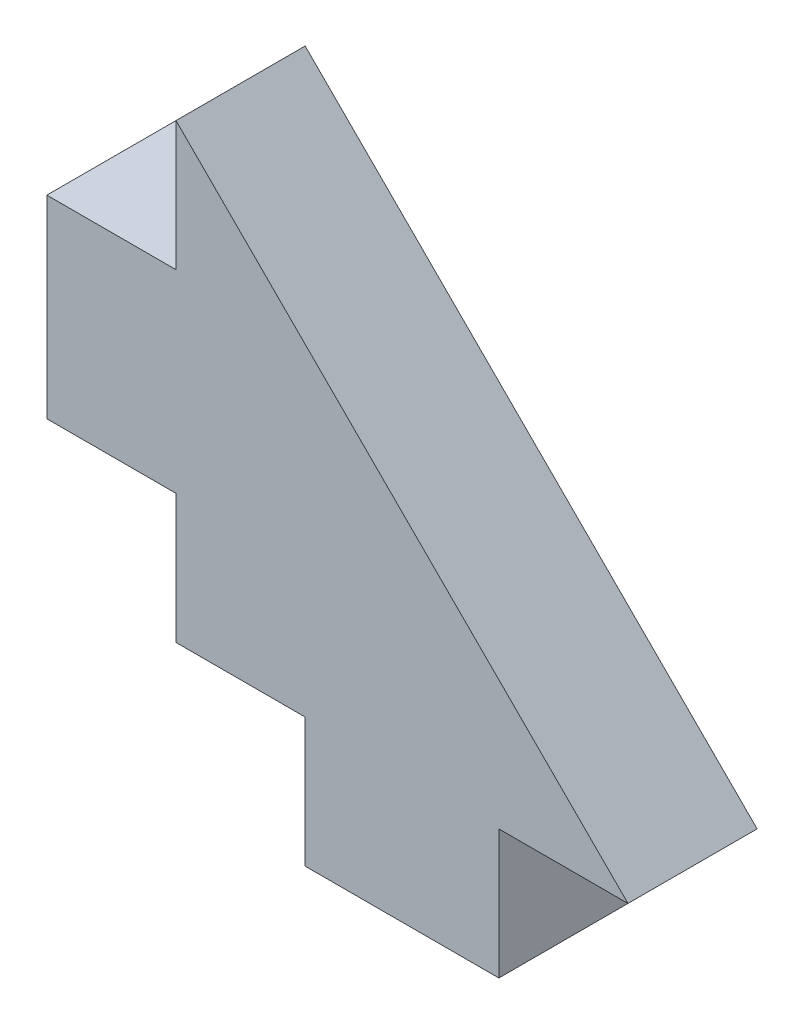
ISO-10303-21;
HEADER;
FILE_DESCRIPTION(('STEP AP214'),'2;1');
FILE_NAME('part.step','',(''),(''),'','','');
FILE_SCHEMA(('AUTOMOTIVE_DESIGN { 1 0 10303 214 1 1 1 1 }'));
ENDSEC;
DATA;
#1=APPLICATION_CONTEXT('core data for automotive mechanical design processes');
#2=APPLICATION_PROTOCOL_DEFINITION('international standard','automotive_design',2000,#1);
#3=PRODUCT_CONTEXT('',#1,'mechanical');
#4=PRODUCT('Part','Part','',(#3));
#5=PRODUCT_RELATED_PRODUCT_CATEGORY('part','',(#4));
#6=PRODUCT_DEFINITION_FORMATION('','',#4);
#7=PRODUCT_DEFINITION_CONTEXT('part definition',#1,'design');
#8=PRODUCT_DEFINITION('design','',#6,#7);
#9=PRODUCT_DEFINITION_SHAPE('','',#8);
#10=(LENGTH_UNIT() NAMED_UNIT(*) SI_UNIT(.MILLI.,.METRE.));
#11=(NAMED_UNIT(*) PLANE_ANGLE_UNIT() SI_UNIT($,.RADIAN.));
#12=(NAMED_UNIT(*) SI_UNIT($,.STERADIAN.) SOLID_ANGLE_UNIT());
#13=UNCERTAINTY_MEASURE_WITH_UNIT(LENGTH_MEASURE(1.E-05),#10,'distance_accuracy_value','');
#14=(GEOMETRIC_REPRESENTATION_CONTEXT(3) GLOBAL_UNCERTAINTY_ASSIGNED_CONTEXT((#13)) GLOBAL_UNIT_ASSIGNED_CONTEXT((#10,
#11,#12)) REPRESENTATION_CONTEXT('',''));
#15=CARTESIAN_POINT('',(0.,0.,0.));
#16=DIRECTION('',(0.,0.,1.));
#17=DIRECTION('',(1.,0.,0.));
#18=AXIS2_PLACEMENT_3D('',#15,#16,#17);
#19=CARTESIAN_POINT('',(0.,5.08,5.08));
#20=DIRECTION('',(1.,0.,0.));
#21=DIRECTION('',(0.,1.,0.));
#22=AXIS2_PLACEMENT_3D('',#19,#20,#21);
#23=PLANE('',#22);
#24=DIRECTION('',(0.,-1.,0.));
#25=VECTOR('',#24,1.);
#26=CARTESIAN_POINT('',(0.,5.08,0.));
#27=LINE('',#26,#25);
#28=CARTESIAN_POINT('',(0.,5.08,0.));
#29=VERTEX_POINT('',#28);
#30=CARTESIAN_POINT('',(0.,0.,0.));
#31=VERTEX_POINT('',#30);
#32=EDGE_CURVE('E147',#29,#31,#27,.T.);
#33=ORIENTED_EDGE('',*,*,#32,.T.);
#34=DIRECTION('',(0.,0.,-1.));
#35=VECTOR('',#34,1.);
#36=CARTESIAN_POINT('',(0.,0.,5.08));
#37=LINE('',#36,#35);
#38=CARTESIAN_POINT('',(0.,0.,5.08));
#39=VERTEX_POINT('',#38);
#40=EDGE_CURVE('E11',#39,#31,#37,.T.);
#41=ORIENTED_EDGE('',*,*,#40,.F.);
#42=DIRECTION('',(0.,-1.,0.));
#43=VECTOR('',#42,1.);
#44=CARTESIAN_POINT('',(0.,5.08,5.08));
#45=LINE('',#44,#43);
#46=CARTESIAN_POINT('',(0.,5.08,5.08));
#47=VERTEX_POINT('',#46);
#48=EDGE_CURVE('E167',#47,#39,#45,.T.);
#49=ORIENTED_EDGE('',*,*,#48,.F.);
#50=DIRECTION('',(0.,0.,-1.));
#51=VECTOR('',#50,1.);
#52=CARTESIAN_POINT('',(0.,5.08,5.08));
#53=LINE('',#52,#51);
#54=EDGE_CURVE('E143',#47,#29,#53,.T.);
#55=ORIENTED_EDGE('',*,*,#54,.T.);
#56=EDGE_LOOP('',(#33,#41,#49,#55));
#57=FACE_BOUND('',#56,.T.);
#58=ADVANCED_FACE('F33',(#57),#23,.F.);
#59=CARTESIAN_POINT('',(0.,0.,5.08));
#60=DIRECTION('',(0.,1.,0.));
#61=DIRECTION('',(0.,0.,1.));
#62=AXIS2_PLACEMENT_3D('',#59,#60,#61);
#63=PLANE('',#62);
#64=DIRECTION('',(1.,0.,0.));
#65=VECTOR('',#64,1.);
#66=CARTESIAN_POINT('',(0.,0.,0.));
#67=LINE('',#66,#65);
#68=CARTESIAN_POINT('',(5.08,0.,0.));
#69=VERTEX_POINT('',#68);
#70=EDGE_CURVE('E150',#31,#69,#67,.T.);
#71=ORIENTED_EDGE('',*,*,#70,.T.);
#72=DIRECTION('',(0.,0.,-1.));
#73=VECTOR('',#72,1.);
#74=CARTESIAN_POINT('',(5.08,0.,5.08));
#75=LINE('',#74,#73);
#76=CARTESIAN_POINT('',(5.08,0.,5.08));
#77=VERTEX_POINT('',#76);
#78=EDGE_CURVE('E41',#77,#69,#75,.T.);
#79=ORIENTED_EDGE('',*,*,#78,.F.);
#80=DIRECTION('',(1.,0.,0.));
#81=VECTOR('',#80,1.);
#82=CARTESIAN_POINT('',(0.,0.,5.08));
#83=LINE('',#82,#81);
#84=EDGE_CURVE('E101',#39,#77,#83,.T.);
#85=ORIENTED_EDGE('',*,*,#84,.F.);
#86=ORIENTED_EDGE('',*,*,#40,.T.);
#87=EDGE_LOOP('',(#71,#79,#85,#86));
#88=FACE_BOUND('',#87,.T.);
#89=ADVANCED_FACE('F239',(#88),#63,.F.);
#90=CARTESIAN_POINT('',(5.08,0.,5.08));
#91=DIRECTION('',(1.,0.,0.));
#92=DIRECTION('',(0.,1.,0.));
#93=AXIS2_PLACEMENT_3D('',#90,#91,#92);
#94=PLANE('',#93);
#95=DIRECTION('',(0.,-1.,0.));
#96=VECTOR('',#95,1.);
#97=CARTESIAN_POINT('',(5.08,0.,0.));
#98=LINE('',#97,#96);
#99=CARTESIAN_POINT('',(5.08,-5.08,0.));
#100=VERTEX_POINT('',#99);
#101=EDGE_CURVE('E152',#69,#100,#98,.T.);
#102=ORIENTED_EDGE('',*,*,#101,.T.);
#103=DIRECTION('',(0.,0.,-1.));
#104=VECTOR('',#103,1.);
#105=CARTESIAN_POINT('',(5.08,-5.08,5.08));
#106=LINE('',#105,#104);
#107=CARTESIAN_POINT('',(5.08,-5.08,5.08));
#108=VERTEX_POINT('',#107);
#109=EDGE_CURVE('E183',#108,#100,#106,.T.);
#110=ORIENTED_EDGE('',*,*,#109,.F.);
#111=DIRECTION('',(0.,-1.,0.));
#112=VECTOR('',#111,1.);
#113=CARTESIAN_POINT('',(5.08,0.,5.08));
#114=LINE('',#113,#112);
#115=EDGE_CURVE('E191',#77,#108,#114,.T.);
#116=ORIENTED_EDGE('',*,*,#115,.F.);
#117=ORIENTED_EDGE('',*,*,#78,.T.);
#118=EDGE_LOOP('',(#102,#110,#116,#117));
#119=FACE_BOUND('',#118,.T.);
#120=ADVANCED_FACE('F189',(#119),#94,.F.);
#121=CARTESIAN_POINT('',(5.08,-5.08,5.08));
#122=DIRECTION('',(0.,1.,0.));
#123=DIRECTION('',(0.,0.,1.));
#124=AXIS2_PLACEMENT_3D('',#121,#122,#123);
#125=PLANE('',#124);
#126=DIRECTION('',(1.,0.,0.));
#127=VECTOR('',#126,1.);
#128=CARTESIAN_POINT('',(5.08,-5.08,0.));
#129=LINE('',#128,#127);
#130=CARTESIAN_POINT('',(12.7,-5.08,0.));
#131=VERTEX_POINT('',#130);
#132=EDGE_CURVE('E154',#100,#131,#129,.T.);
#133=ORIENTED_EDGE('',*,*,#132,.T.);
#134=DIRECTION('',(0.,0.,-1.));
#135=VECTOR('',#134,1.);
#136=CARTESIAN_POINT('',(12.7,-5.08,5.08));
#137=LINE('',#136,#135);
#138=CARTESIAN_POINT('',(12.7,-5.08,5.08));
#139=VERTEX_POINT('',#138);
#140=EDGE_CURVE('E180',#139,#131,#137,.T.);
#141=ORIENTED_EDGE('',*,*,#140,.F.);
#142=DIRECTION('',(1.,0.,0.));
#143=VECTOR('',#142,1.);
#144=CARTESIAN_POINT('',(5.08,-5.08,5.08));
#145=LINE('',#144,#143);
#146=EDGE_CURVE('E209',#108,#139,#145,.T.);
#147=ORIENTED_EDGE('',*,*,#146,.F.);
#148=ORIENTED_EDGE('',*,*,#109,.T.);
#149=EDGE_LOOP('',(#133,#141,#147,#148));
#150=FACE_BOUND('',#149,.T.);
#151=ADVANCED_FACE('F200',(#150),#125,.F.);
#152=CARTESIAN_POINT('',(12.7,-5.08,5.08));
#153=DIRECTION('',(-1.,0.,0.));
#154=DIRECTION('',(0.,0.,1.));
#155=AXIS2_PLACEMENT_3D('',#152,#153,#154);
#156=PLANE('',#155);
#157=DIRECTION('',(0.,1.,0.));
#158=VECTOR('',#157,1.);
#159=CARTESIAN_POINT('',(12.7,-5.08,0.));
#160=LINE('',#159,#158);
#161=CARTESIAN_POINT('',(12.7,0.,0.));
#162=VERTEX_POINT('',#161);
#163=EDGE_CURVE('E156',#131,#162,#160,.T.);
#164=ORIENTED_EDGE('',*,*,#163,.T.);
#165=DIRECTION('',(0.,0.,-1.));
#166=VECTOR('',#165,1.);
#167=CARTESIAN_POINT('',(12.7,0.,5.08));
#168=LINE('',#167,#166);
#169=CARTESIAN_POINT('',(12.7,0.,5.08));
#170=VERTEX_POINT('',#169);
#171=EDGE_CURVE('E177',#170,#162,#168,.T.);
#172=ORIENTED_EDGE('',*,*,#171,.F.);
#173=DIRECTION('',(0.,1.,0.));
#174=VECTOR('',#173,1.);
#175=CARTESIAN_POINT('',(12.7,-5.08,5.08));
#176=LINE('',#175,#174);
#177=EDGE_CURVE('E206',#139,#170,#176,.T.);
#178=ORIENTED_EDGE('',*,*,#177,.F.);
#179=ORIENTED_EDGE('',*,*,#140,.T.);
#180=EDGE_LOOP('',(#164,#172,#178,#179));
#181=FACE_BOUND('',#180,.T.);
#182=ADVANCED_FACE('F204',(#181),#156,.F.);
#183=CARTESIAN_POINT('',(12.7,0.,5.08));
#184=DIRECTION('',(0.,1.,0.));
#185=DIRECTION('',(0.,0.,1.));
#186=AXIS2_PLACEMENT_3D('',#183,#184,#185);
#187=PLANE('',#186);
#188=DIRECTION('',(1.,0.,0.));
#189=VECTOR('',#188,1.);
#190=CARTESIAN_POINT('',(12.7,0.,0.));
#191=LINE('',#190,#189);
#192=CARTESIAN_POINT('',(17.78,0.,0.));
#193=VERTEX_POINT('',#192);
#194=EDGE_CURVE('E158',#162,#193,#191,.T.);
#195=ORIENTED_EDGE('',*,*,#194,.T.);
#196=DIRECTION('',(0.,0.,-1.));
#197=VECTOR('',#196,1.);
#198=CARTESIAN_POINT('',(17.78,0.,5.08));
#199=LINE('',#198,#197);
#200=CARTESIAN_POINT('',(17.78,0.,5.08));
#201=VERTEX_POINT('',#200);
#202=EDGE_CURVE('E174',#201,#193,#199,.T.);
#203=ORIENTED_EDGE('',*,*,#202,.F.);
#204=DIRECTION('',(1.,0.,0.));
#205=VECTOR('',#204,1.);
#206=CARTESIAN_POINT('',(12.7,0.,5.08));
#207=LINE('',#206,#205);
#208=EDGE_CURVE('E208',#170,#201,#207,.T.);
#209=ORIENTED_EDGE('',*,*,#208,.F.);
#210=ORIENTED_EDGE('',*,*,#171,.T.);
#211=EDGE_LOOP('',(#195,#203,#209,#210));
#212=FACE_BOUND('',#211,.T.);
#213=ADVANCED_FACE('F252',(#212),#187,.F.);
#214=CARTESIAN_POINT('',(0.,17.78,5.08));
#215=DIRECTION('',(-0.707106781186548,-0.707106781186548,0.));
#216=DIRECTION('',(0.707106781186548,-0.707106781186548,0.));
#217=AXIS2_PLACEMENT_3D('',#214,#215,#216);
#218=PLANE('',#217);
#219=DIRECTION('',(-0.707106781186548,0.707106781186548,0.));
#220=VECTOR('',#219,1.);
#221=CARTESIAN_POINT('',(0.,17.78,0.));
#222=LINE('',#221,#220);
#223=CARTESIAN_POINT('',(0.,17.78,0.));
#224=VERTEX_POINT('',#223);
#225=EDGE_CURVE('E160',#193,#224,#222,.T.);
#226=ORIENTED_EDGE('',*,*,#225,.T.);
#227=DIRECTION('',(0.,0.,-1.));
#228=VECTOR('',#227,1.);
#229=CARTESIAN_POINT('',(0.,17.78,5.08));
#230=LINE('',#229,#228);
#231=CARTESIAN_POINT('',(0.,17.78,5.08));
#232=VERTEX_POINT('',#231);
#233=EDGE_CURVE('E171',#232,#224,#230,.T.);
#234=ORIENTED_EDGE('',*,*,#233,.F.);
#235=DIRECTION('',(-0.707106781186548,0.707106781186548,0.));
#236=VECTOR('',#235,1.);
#237=CARTESIAN_POINT('',(0.,17.78,5.08));
#238=LINE('',#237,#236);
#239=EDGE_CURVE('E211',#201,#232,#238,.T.);
#240=ORIENTED_EDGE('',*,*,#239,.F.);
#241=ORIENTED_EDGE('',*,*,#202,.T.);
#242=EDGE_LOOP('',(#226,#234,#240,#241));
#243=FACE_BOUND('',#242,.T.);
#244=ADVANCED_FACE('F220',(#243),#218,.F.);
#245=CARTESIAN_POINT('',(0.,17.78,5.08));
#246=DIRECTION('',(1.,0.,0.));
#247=DIRECTION('',(0.,1.,0.));
#248=AXIS2_PLACEMENT_3D('',#245,#246,#247);
#249=PLANE('',#248);
#250=DIRECTION('',(0.,-1.,0.));
#251=VECTOR('',#250,1.);
#252=CARTESIAN_POINT('',(0.,17.78,0.));
#253=LINE('',#252,#251);
#254=CARTESIAN_POINT('',(0.,12.7,0.));
#255=VERTEX_POINT('',#254);
#256=EDGE_CURVE('E162',#224,#255,#253,.T.);
#257=ORIENTED_EDGE('',*,*,#256,.T.);
#258=DIRECTION('',(0.,0.,-1.));
#259=VECTOR('',#258,1.);
#260=CARTESIAN_POINT('',(0.,12.7,5.08));
#261=LINE('',#260,#259);
#262=CARTESIAN_POINT('',(0.,12.7,5.08));
#263=VERTEX_POINT('',#262);
#264=EDGE_CURVE('E138',#263,#255,#261,.T.);
#265=ORIENTED_EDGE('',*,*,#264,.F.);
#266=DIRECTION('',(0.,-1.,0.));
#267=VECTOR('',#266,1.);
#268=CARTESIAN_POINT('',(0.,17.78,5.08));
#269=LINE('',#268,#267);
#270=EDGE_CURVE('E129',#232,#263,#269,.T.);
#271=ORIENTED_EDGE('',*,*,#270,.F.);
#272=ORIENTED_EDGE('',*,*,#233,.T.);
#273=EDGE_LOOP('',(#257,#265,#271,#272));
#274=FACE_BOUND('',#273,.T.);
#275=ADVANCED_FACE('F224',(#274),#249,.F.);
#276=CARTESIAN_POINT('',(-5.08,12.7,5.08));
#277=DIRECTION('',(0.,-1.,0.));
#278=DIRECTION('',(0.,0.,-1.));
#279=AXIS2_PLACEMENT_3D('',#276,#277,#278);
#280=PLANE('',#279);
#281=DIRECTION('',(-1.,0.,0.));
#282=VECTOR('',#281,1.);
#283=CARTESIAN_POINT('',(-5.08,12.7,0.));
#284=LINE('',#283,#282);
#285=CARTESIAN_POINT('',(-5.08,12.7,0.));
#286=VERTEX_POINT('',#285);
#287=EDGE_CURVE('E137',#255,#286,#284,.T.);
#288=ORIENTED_EDGE('',*,*,#287,.T.);
#289=DIRECTION('',(0.,0.,-1.));
#290=VECTOR('',#289,1.);
#291=CARTESIAN_POINT('',(-5.08,12.7,5.08));
#292=LINE('',#291,#290);
#293=CARTESIAN_POINT('',(-5.08,12.7,5.08));
#294=VERTEX_POINT('',#293);
#295=EDGE_CURVE('E134',#294,#286,#292,.T.);
#296=ORIENTED_EDGE('',*,*,#295,.F.);
#297=DIRECTION('',(-1.,0.,0.));
#298=VECTOR('',#297,1.);
#299=CARTESIAN_POINT('',(-5.08,12.7,5.08));
#300=LINE('',#299,#298);
#301=EDGE_CURVE('E123',#263,#294,#300,.T.);
#302=ORIENTED_EDGE('',*,*,#301,.F.);
#303=ORIENTED_EDGE('',*,*,#264,.T.);
#304=EDGE_LOOP('',(#288,#296,#302,#303));
#305=FACE_BOUND('',#304,.T.);
#306=ADVANCED_FACE('F135',(#305),#280,.F.);
#307=CARTESIAN_POINT('',(-5.08,5.08,5.08));
#308=DIRECTION('',(1.,0.,0.));
#309=DIRECTION('',(0.,0.,-1.));
#310=AXIS2_PLACEMENT_3D('',#307,#308,#309);
#311=PLANE('',#310);
#312=DIRECTION('',(0.,-1.,0.));
#313=VECTOR('',#312,1.);
#314=CARTESIAN_POINT('',(-5.08,5.08,0.));
#315=LINE('',#314,#313);
#316=CARTESIAN_POINT('',(-5.08,5.08,0.));
#317=VERTEX_POINT('',#316);
#318=EDGE_CURVE('E87',#286,#317,#315,.T.);
#319=ORIENTED_EDGE('',*,*,#318,.T.);
#320=DIRECTION('',(0.,0.,-1.));
#321=VECTOR('',#320,1.);
#322=CARTESIAN_POINT('',(-5.08,5.08,5.08));
#323=LINE('',#322,#321);
#324=CARTESIAN_POINT('',(-5.08,5.08,5.08));
#325=VERTEX_POINT('',#324);
#326=EDGE_CURVE('E139',#325,#317,#323,.T.);
#327=ORIENTED_EDGE('',*,*,#326,.F.);
#328=DIRECTION('',(0.,-1.,0.));
#329=VECTOR('',#328,1.);
#330=CARTESIAN_POINT('',(-5.08,5.08,5.08));
#331=LINE('',#330,#329);
#332=EDGE_CURVE('E127',#294,#325,#331,.T.);
#333=ORIENTED_EDGE('',*,*,#332,.F.);
#334=ORIENTED_EDGE('',*,*,#295,.T.);
#335=EDGE_LOOP('',(#319,#327,#333,#334));
#336=FACE_BOUND('',#335,.T.);
#337=ADVANCED_FACE('F141',(#336),#311,.F.);
#338=CARTESIAN_POINT('',(0.,5.08,5.08));
#339=DIRECTION('',(0.,1.,0.));
#340=DIRECTION('',(0.,0.,1.));
#341=AXIS2_PLACEMENT_3D('',#338,#339,#340);
#342=PLANE('',#341);
#343=DIRECTION('',(1.,0.,0.));
#344=VECTOR('',#343,1.);
#345=CARTESIAN_POINT('',(0.,5.08,0.));
#346=LINE('',#345,#344);
#347=EDGE_CURVE('E93',#317,#29,#346,.T.);
#348=ORIENTED_EDGE('',*,*,#347,.T.);
#349=ORIENTED_EDGE('',*,*,#54,.F.);
#350=DIRECTION('',(1.,0.,0.));
#351=VECTOR('',#350,1.);
#352=CARTESIAN_POINT('',(0.,5.08,5.08));
#353=LINE('',#352,#351);
#354=EDGE_CURVE('E49',#325,#47,#353,.T.);
#355=ORIENTED_EDGE('',*,*,#354,.F.);
#356=ORIENTED_EDGE('',*,*,#326,.T.);
#357=EDGE_LOOP('',(#348,#349,#355,#356));
#358=FACE_BOUND('',#357,.T.);
#359=ADVANCED_FACE('F228',(#358),#342,.F.);
#360=CARTESIAN_POINT('',(0.,0.,5.08));
#361=DIRECTION('',(0.,0.,1.));
#362=DIRECTION('',(1.,0.,0.));
#363=AXIS2_PLACEMENT_3D('',#360,#361,#362);
#364=PLANE('',#363);
#365=ORIENTED_EDGE('',*,*,#48,.T.);
#366=ORIENTED_EDGE('',*,*,#84,.T.);
#367=ORIENTED_EDGE('',*,*,#115,.T.);
#368=ORIENTED_EDGE('',*,*,#146,.T.);
#369=ORIENTED_EDGE('',*,*,#177,.T.);
#370=ORIENTED_EDGE('',*,*,#208,.T.);
#371=ORIENTED_EDGE('',*,*,#239,.T.);
#372=ORIENTED_EDGE('',*,*,#270,.T.);
#373=ORIENTED_EDGE('',*,*,#301,.T.);
#374=ORIENTED_EDGE('',*,*,#332,.T.);
#375=ORIENTED_EDGE('',*,*,#354,.T.);
#376=EDGE_LOOP('',(#365,#366,#367,#368,#369,#370,#371,#372,#373,#374,#375));
#377=FACE_BOUND('',#376,.T.);
#378=ADVANCED_FACE('F125',(#377),#364,.T.);
#379=CARTESIAN_POINT('',(0.,0.,0.));
#380=DIRECTION('',(0.,0.,1.));
#381=DIRECTION('',(1.,0.,0.));
#382=AXIS2_PLACEMENT_3D('',#379,#380,#381);
#383=PLANE('',#382);
#384=ORIENTED_EDGE('',*,*,#32,.F.);
#385=ORIENTED_EDGE('',*,*,#347,.F.);
#386=ORIENTED_EDGE('',*,*,#318,.F.);
#387=ORIENTED_EDGE('',*,*,#287,.F.);
#388=ORIENTED_EDGE('',*,*,#256,.F.);
#389=ORIENTED_EDGE('',*,*,#225,.F.);
#390=ORIENTED_EDGE('',*,*,#194,.F.);
#391=ORIENTED_EDGE('',*,*,#163,.F.);
#392=ORIENTED_EDGE('',*,*,#132,.F.);
#393=ORIENTED_EDGE('',*,*,#101,.F.);
#394=ORIENTED_EDGE('',*,*,#70,.F.);
#395=EDGE_LOOP('',(#384,#385,#386,#387,#388,#389,#390,#391,#392,#393,#394));
#396=FACE_BOUND('',#395,.T.);
#397=ADVANCED_FACE('F195',(#396),#383,.F.);
#398=CLOSED_SHELL('',(#58,#89,#120,#151,#182,#213,#244,#275,#306,#337,#359,#378,#397));
#399=MANIFOLD_SOLID_BREP('B2',#398);
#400=ADVANCED_BREP_SHAPE_REPRESENTATION('',(#18,#399),#14);
#401=SHAPE_DEFINITION_REPRESENTATION(#9,#400);
ENDSEC;
END-ISO-10303-21;
